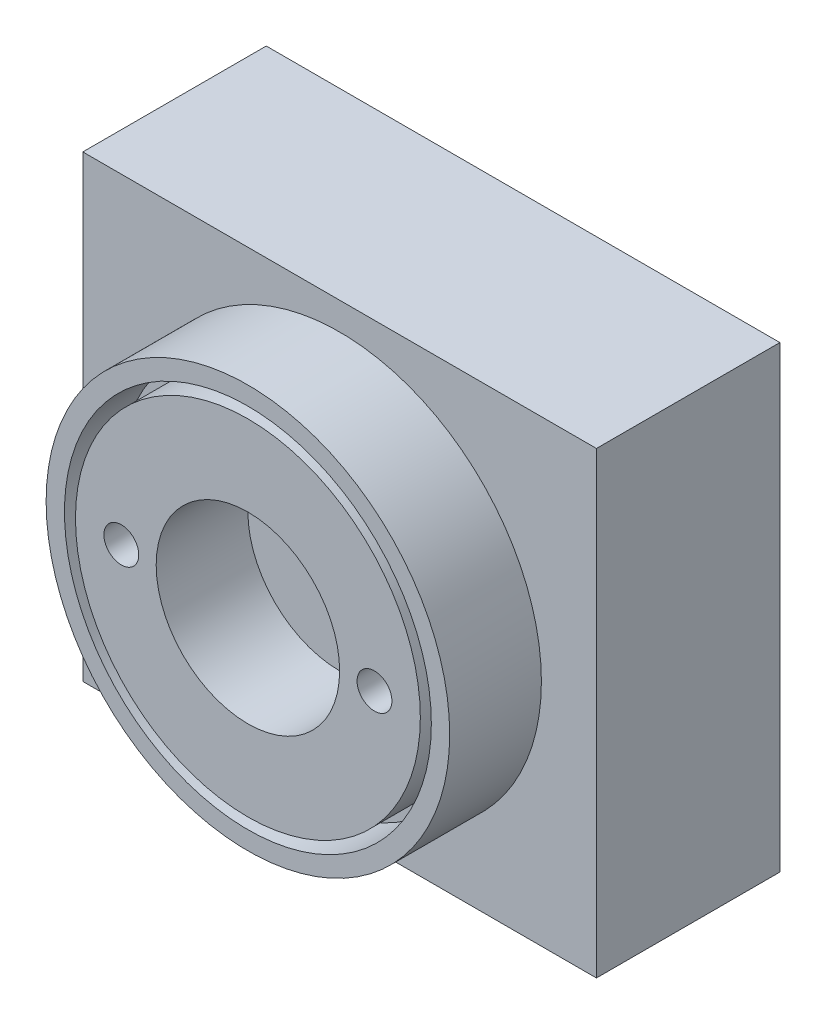
ISO-10303-21;
HEADER;
FILE_DESCRIPTION(('STEP AP214'),'2;1');
FILE_NAME('part.step','',(''),(''),'','','');
FILE_SCHEMA(('AUTOMOTIVE_DESIGN { 1 0 10303 214 1 1 1 1 }'));
ENDSEC;
DATA;
#1=APPLICATION_CONTEXT('core data for automotive mechanical design processes');
#2=APPLICATION_PROTOCOL_DEFINITION('international standard','automotive_design',2000,#1);
#3=PRODUCT_CONTEXT('',#1,'mechanical');
#4=PRODUCT('Part','Part','',(#3));
#5=PRODUCT_RELATED_PRODUCT_CATEGORY('part','',(#4));
#6=PRODUCT_DEFINITION_FORMATION('','',#4);
#7=PRODUCT_DEFINITION_CONTEXT('part definition',#1,'design');
#8=PRODUCT_DEFINITION('design','',#6,#7);
#9=PRODUCT_DEFINITION_SHAPE('','',#8);
#10=(LENGTH_UNIT() NAMED_UNIT(*) SI_UNIT(.MILLI.,.METRE.));
#11=(NAMED_UNIT(*) PLANE_ANGLE_UNIT() SI_UNIT($,.RADIAN.));
#12=(NAMED_UNIT(*) SI_UNIT($,.STERADIAN.) SOLID_ANGLE_UNIT());
#13=UNCERTAINTY_MEASURE_WITH_UNIT(LENGTH_MEASURE(1.E-05),#10,'distance_accuracy_value','');
#14=(GEOMETRIC_REPRESENTATION_CONTEXT(3) GLOBAL_UNCERTAINTY_ASSIGNED_CONTEXT((#13)) GLOBAL_UNIT_ASSIGNED_CONTEXT((#10,
#11,#12)) REPRESENTATION_CONTEXT('',''));
#15=CARTESIAN_POINT('',(0.,0.,0.));
#16=DIRECTION('',(0.,0.,1.));
#17=DIRECTION('',(1.,0.,0.));
#18=AXIS2_PLACEMENT_3D('',#15,#16,#17);
#19=CARTESIAN_POINT('',(0.,0.,10.));
#20=DIRECTION('',(0.,0.,1.));
#21=DIRECTION('',(1.,0.,0.));
#22=AXIS2_PLACEMENT_3D('',#19,#20,#21);
#23=PLANE('',#22);
#24=CARTESIAN_POINT('',(0.,0.,10.));
#25=DIRECTION('',(0.,0.,1.));
#26=DIRECTION('',(1.,0.,0.));
#27=AXIS2_PLACEMENT_3D('',#24,#25,#26);
#28=CIRCLE('',#27,47.);
#29=CARTESIAN_POINT('',(47.,0.,10.));
#30=VERTEX_POINT('',#29);
#31=EDGE_CURVE('E137',#30,#30,#28,.T.);
#32=ORIENTED_EDGE('',*,*,#31,.T.);
#33=EDGE_LOOP('',(#32));
#34=FACE_BOUND('',#33,.T.);
#35=CARTESIAN_POINT('',(34.5,0.,10.));
#36=DIRECTION('',(0.,0.,1.));
#37=DIRECTION('',(1.,0.,0.));
#38=AXIS2_PLACEMENT_3D('',#35,#36,#37);
#39=CIRCLE('',#38,4.75);
#40=CARTESIAN_POINT('',(39.25,0.,10.));
#41=VERTEX_POINT('',#40);
#42=EDGE_CURVE('E145',#41,#41,#39,.F.);
#43=ORIENTED_EDGE('',*,*,#42,.T.);
#44=EDGE_LOOP('',(#43));
#45=FACE_BOUND('',#44,.T.);
#46=CARTESIAN_POINT('',(0.,0.,10.));
#47=DIRECTION('',(0.,0.,1.));
#48=DIRECTION('',(1.,0.,0.));
#49=AXIS2_PLACEMENT_3D('',#46,#47,#48);
#50=CIRCLE('',#49,25.);
#51=CARTESIAN_POINT('',(25.,0.,10.));
#52=VERTEX_POINT('',#51);
#53=EDGE_CURVE('E151',#52,#52,#50,.T.);
#54=ORIENTED_EDGE('',*,*,#53,.F.);
#55=EDGE_LOOP('',(#54));
#56=FACE_BOUND('',#55,.T.);
#57=CARTESIAN_POINT('',(-34.5,0.,10.));
#58=DIRECTION('',(0.,0.,1.));
#59=DIRECTION('',(1.,0.,0.));
#60=AXIS2_PLACEMENT_3D('',#57,#58,#59);
#61=CIRCLE('',#60,4.75);
#62=CARTESIAN_POINT('',(-29.75,0.,10.));
#63=VERTEX_POINT('',#62);
#64=EDGE_CURVE('E136',#63,#63,#61,.T.);
#65=ORIENTED_EDGE('',*,*,#64,.F.);
#66=EDGE_LOOP('',(#65));
#67=FACE_BOUND('',#66,.T.);
#68=ADVANCED_FACE('F51',(#34,#45,#56,#67),#23,.T.);
#69=CARTESIAN_POINT('',(0.,0.,10.));
#70=DIRECTION('',(0.,0.,1.));
#71=DIRECTION('',(1.,0.,0.));
#72=AXIS2_PLACEMENT_3D('',#69,#70,#71);
#73=CIRCLE('',#72,55.);
#74=CARTESIAN_POINT('',(55.,0.,10.));
#75=VERTEX_POINT('',#74);
#76=EDGE_CURVE('E61',#75,#75,#73,.T.);
#77=ORIENTED_EDGE('',*,*,#76,.T.);
#78=EDGE_LOOP('',(#77));
#79=FACE_BOUND('',#78,.T.);
#80=CARTESIAN_POINT('',(0.,0.,10.));
#81=DIRECTION('',(0.,0.,1.));
#82=DIRECTION('',(1.,0.,0.));
#83=AXIS2_PLACEMENT_3D('',#80,#81,#82);
#84=CIRCLE('',#83,50.);
#85=CARTESIAN_POINT('',(50.,0.,10.));
#86=VERTEX_POINT('',#85);
#87=EDGE_CURVE('E133',#86,#86,#84,.T.);
#88=ORIENTED_EDGE('',*,*,#87,.F.);
#89=EDGE_LOOP('',(#88));
#90=FACE_BOUND('',#89,.T.);
#91=ADVANCED_FACE('F159',(#79,#90),#23,.T.);
#92=CARTESIAN_POINT('',(0.,0.,-15.));
#93=DIRECTION('',(0.,0.,1.));
#94=DIRECTION('',(1.,0.,0.));
#95=AXIS2_PLACEMENT_3D('',#92,#93,#94);
#96=CYLINDRICAL_SURFACE('',#95,55.);
#97=CARTESIAN_POINT('',(0.,0.,-15.));
#98=DIRECTION('',(0.,0.,1.));
#99=DIRECTION('',(1.,0.,0.));
#100=AXIS2_PLACEMENT_3D('',#97,#98,#99);
#101=CIRCLE('',#100,55.);
#102=CARTESIAN_POINT('',(55.,0.,-15.));
#103=VERTEX_POINT('',#102);
#104=EDGE_CURVE('E55',#103,#103,#101,.T.);
#105=ORIENTED_EDGE('',*,*,#104,.T.);
#106=EDGE_LOOP('',(#105));
#107=FACE_BOUND('',#106,.T.);
#108=ORIENTED_EDGE('',*,*,#76,.F.);
#109=EDGE_LOOP('',(#108));
#110=FACE_BOUND('',#109,.T.);
#111=ADVANCED_FACE('F53',(#107,#110),#96,.T.);
#112=CARTESIAN_POINT('',(0.,0.,-15.));
#113=DIRECTION('',(0.,0.,1.));
#114=DIRECTION('',(1.,0.,0.));
#115=AXIS2_PLACEMENT_3D('',#112,#113,#114);
#116=CYLINDRICAL_SURFACE('',#115,25.);
#117=CARTESIAN_POINT('',(0.,0.,-15.));
#118=DIRECTION('',(0.,0.,1.));
#119=DIRECTION('',(1.,0.,0.));
#120=AXIS2_PLACEMENT_3D('',#117,#118,#119);
#121=CIRCLE('',#120,25.);
#122=CARTESIAN_POINT('',(25.,0.,-15.));
#123=VERTEX_POINT('',#122);
#124=EDGE_CURVE('E12',#123,#123,#121,.T.);
#125=ORIENTED_EDGE('',*,*,#124,.F.);
#126=EDGE_LOOP('',(#125));
#127=FACE_BOUND('',#126,.T.);
#128=ORIENTED_EDGE('',*,*,#53,.T.);
#129=EDGE_LOOP('',(#128));
#130=FACE_BOUND('',#129,.T.);
#131=ADVANCED_FACE('F163',(#127,#130),#116,.F.);
#132=CARTESIAN_POINT('',(34.5,0.,-5.));
#133=DIRECTION('',(0.,0.,1.));
#134=DIRECTION('',(1.,0.,0.));
#135=AXIS2_PLACEMENT_3D('',#132,#133,#134);
#136=CYLINDRICAL_SURFACE('',#135,4.75);
#137=CARTESIAN_POINT('',(34.5,0.,-5.));
#138=DIRECTION('',(0.,0.,1.));
#139=DIRECTION('',(1.,0.,0.));
#140=AXIS2_PLACEMENT_3D('',#137,#138,#139);
#141=CIRCLE('',#140,4.75);
#142=CARTESIAN_POINT('',(39.25,0.,-5.));
#143=VERTEX_POINT('',#142);
#144=EDGE_CURVE('E148',#143,#143,#141,.F.);
#145=ORIENTED_EDGE('',*,*,#144,.T.);
#146=EDGE_LOOP('',(#145));
#147=FACE_BOUND('',#146,.T.);
#148=ORIENTED_EDGE('',*,*,#42,.F.);
#149=EDGE_LOOP('',(#148));
#150=FACE_BOUND('',#149,.T.);
#151=ADVANCED_FACE('F169',(#147,#150),#136,.F.);
#152=CARTESIAN_POINT('',(0.,0.,-5.));
#153=DIRECTION('',(0.,0.,1.));
#154=DIRECTION('',(1.,0.,0.));
#155=AXIS2_PLACEMENT_3D('',#152,#153,#154);
#156=PLANE('',#155);
#157=ORIENTED_EDGE('',*,*,#144,.F.);
#158=EDGE_LOOP('',(#157));
#159=FACE_BOUND('',#158,.T.);
#160=ADVANCED_FACE('F181',(#159),#156,.T.);
#161=CARTESIAN_POINT('',(0.,0.,-5.));
#162=DIRECTION('',(0.,0.,1.));
#163=DIRECTION('',(1.,0.,0.));
#164=AXIS2_PLACEMENT_3D('',#161,#162,#163);
#165=CYLINDRICAL_SURFACE('',#164,47.);
#166=CARTESIAN_POINT('',(0.,0.,-5.));
#167=DIRECTION('',(0.,0.,1.));
#168=DIRECTION('',(1.,0.,0.));
#169=AXIS2_PLACEMENT_3D('',#166,#167,#168);
#170=CIRCLE('',#169,47.);
#171=CARTESIAN_POINT('',(47.,0.,-5.));
#172=VERTEX_POINT('',#171);
#173=EDGE_CURVE('E129',#172,#172,#170,.T.);
#174=ORIENTED_EDGE('',*,*,#173,.T.);
#175=EDGE_LOOP('',(#174));
#176=FACE_BOUND('',#175,.T.);
#177=ORIENTED_EDGE('',*,*,#31,.F.);
#178=EDGE_LOOP('',(#177));
#179=FACE_BOUND('',#178,.T.);
#180=ADVANCED_FACE('F185',(#176,#179),#165,.T.);
#181=CARTESIAN_POINT('',(0.,0.,-5.));
#182=DIRECTION('',(0.,0.,1.));
#183=DIRECTION('',(1.,0.,0.));
#184=AXIS2_PLACEMENT_3D('',#181,#182,#183);
#185=CYLINDRICAL_SURFACE('',#184,50.);
#186=CARTESIAN_POINT('',(0.,0.,-5.));
#187=DIRECTION('',(0.,0.,1.));
#188=DIRECTION('',(1.,0.,0.));
#189=AXIS2_PLACEMENT_3D('',#186,#187,#188);
#190=CIRCLE('',#189,50.);
#191=CARTESIAN_POINT('',(50.,0.,-5.));
#192=VERTEX_POINT('',#191);
#193=EDGE_CURVE('E132',#192,#192,#190,.T.);
#194=ORIENTED_EDGE('',*,*,#193,.F.);
#195=EDGE_LOOP('',(#194));
#196=FACE_BOUND('',#195,.T.);
#197=ORIENTED_EDGE('',*,*,#87,.T.);
#198=EDGE_LOOP('',(#197));
#199=FACE_BOUND('',#198,.T.);
#200=ADVANCED_FACE('F199',(#196,#199),#185,.F.);
#201=CARTESIAN_POINT('',(0.,0.,-5.));
#202=DIRECTION('',(0.,0.,1.));
#203=DIRECTION('',(1.,0.,0.));
#204=AXIS2_PLACEMENT_3D('',#201,#202,#203);
#205=PLANE('',#204);
#206=ORIENTED_EDGE('',*,*,#173,.F.);
#207=EDGE_LOOP('',(#206));
#208=FACE_BOUND('',#207,.T.);
#209=ORIENTED_EDGE('',*,*,#193,.T.);
#210=EDGE_LOOP('',(#209));
#211=FACE_BOUND('',#210,.T.);
#212=ADVANCED_FACE('F191',(#208,#211),#205,.T.);
#213=CARTESIAN_POINT('',(-34.5,0.,-5.));
#214=DIRECTION('',(0.,0.,1.));
#215=DIRECTION('',(1.,0.,0.));
#216=AXIS2_PLACEMENT_3D('',#213,#214,#215);
#217=CYLINDRICAL_SURFACE('',#216,4.75);
#218=CARTESIAN_POINT('',(-34.5,0.,-5.));
#219=DIRECTION('',(0.,0.,1.));
#220=DIRECTION('',(1.,0.,0.));
#221=AXIS2_PLACEMENT_3D('',#218,#219,#220);
#222=CIRCLE('',#221,4.75);
#223=CARTESIAN_POINT('',(-29.75,0.,-5.));
#224=VERTEX_POINT('',#223);
#225=EDGE_CURVE('E142',#224,#224,#222,.T.);
#226=ORIENTED_EDGE('',*,*,#225,.F.);
#227=EDGE_LOOP('',(#226));
#228=FACE_BOUND('',#227,.T.);
#229=ORIENTED_EDGE('',*,*,#64,.T.);
#230=EDGE_LOOP('',(#229));
#231=FACE_BOUND('',#230,.T.);
#232=ADVANCED_FACE('F187',(#228,#231),#217,.F.);
#233=CARTESIAN_POINT('',(0.,0.,-5.));
#234=DIRECTION('',(0.,0.,1.));
#235=DIRECTION('',(1.,0.,0.));
#236=AXIS2_PLACEMENT_3D('',#233,#234,#235);
#237=PLANE('',#236);
#238=ORIENTED_EDGE('',*,*,#225,.T.);
#239=EDGE_LOOP('',(#238));
#240=FACE_BOUND('',#239,.T.);
#241=ADVANCED_FACE('F190',(#240),#237,.T.);
#242=CARTESIAN_POINT('',(0.,0.,-15.));
#243=DIRECTION('',(0.,0.,1.));
#244=DIRECTION('',(1.,0.,0.));
#245=AXIS2_PLACEMENT_3D('',#242,#243,#244);
#246=PLANE('',#245);
#247=ORIENTED_EDGE('',*,*,#104,.F.);
#248=EDGE_LOOP('',(#247));
#249=FACE_BOUND('',#248,.T.);
#250=DIRECTION('',(0.,1.,0.));
#251=VECTOR('',#250,1.);
#252=CARTESIAN_POINT('',(-70.,-62.5,-15.));
#253=LINE('',#252,#251);
#254=CARTESIAN_POINT('',(-70.,-62.5,-15.));
#255=VERTEX_POINT('',#254);
#256=CARTESIAN_POINT('',(-70.,62.5,-15.));
#257=VERTEX_POINT('',#256);
#258=EDGE_CURVE('E120',#255,#257,#253,.T.);
#259=ORIENTED_EDGE('',*,*,#258,.F.);
#260=DIRECTION('',(-1.,0.,0.));
#261=VECTOR('',#260,1.);
#262=CARTESIAN_POINT('',(70.,-62.5,-15.));
#263=LINE('',#262,#261);
#264=CARTESIAN_POINT('',(70.,-62.5,-15.));
#265=VERTEX_POINT('',#264);
#266=EDGE_CURVE('E92',#265,#255,#263,.T.);
#267=ORIENTED_EDGE('',*,*,#266,.F.);
#268=DIRECTION('',(0.,-1.,0.));
#269=VECTOR('',#268,1.);
#270=CARTESIAN_POINT('',(70.,-62.5,-15.));
#271=LINE('',#270,#269);
#272=CARTESIAN_POINT('',(70.,62.5,-15.));
#273=VERTEX_POINT('',#272);
#274=EDGE_CURVE('E86',#273,#265,#271,.T.);
#275=ORIENTED_EDGE('',*,*,#274,.F.);
#276=DIRECTION('',(1.,0.,0.));
#277=VECTOR('',#276,1.);
#278=CARTESIAN_POINT('',(70.,62.5,-15.));
#279=LINE('',#278,#277);
#280=EDGE_CURVE('E110',#257,#273,#279,.T.);
#281=ORIENTED_EDGE('',*,*,#280,.F.);
#282=EDGE_LOOP('',(#259,#267,#275,#281));
#283=FACE_BOUND('',#282,.T.);
#284=ADVANCED_FACE('F195',(#249,#283),#246,.T.);
#285=CARTESIAN_POINT('',(0.,0.,-65.));
#286=DIRECTION('',(0.,0.,1.));
#287=DIRECTION('',(1.,0.,0.));
#288=AXIS2_PLACEMENT_3D('',#285,#286,#287);
#289=PLANE('',#288);
#290=DIRECTION('',(0.,1.,0.));
#291=VECTOR('',#290,1.);
#292=CARTESIAN_POINT('',(-70.,-62.5,-65.));
#293=LINE('',#292,#291);
#294=CARTESIAN_POINT('',(-70.,-62.5,-65.));
#295=VERTEX_POINT('',#294);
#296=CARTESIAN_POINT('',(-70.,62.5,-65.));
#297=VERTEX_POINT('',#296);
#298=EDGE_CURVE('E105',#295,#297,#293,.T.);
#299=ORIENTED_EDGE('',*,*,#298,.T.);
#300=DIRECTION('',(1.,0.,0.));
#301=VECTOR('',#300,1.);
#302=CARTESIAN_POINT('',(70.,62.5,-65.));
#303=LINE('',#302,#301);
#304=CARTESIAN_POINT('',(70.,62.5,-65.));
#305=VERTEX_POINT('',#304);
#306=EDGE_CURVE('E100',#297,#305,#303,.T.);
#307=ORIENTED_EDGE('',*,*,#306,.T.);
#308=DIRECTION('',(0.,-1.,0.));
#309=VECTOR('',#308,1.);
#310=CARTESIAN_POINT('',(70.,-62.5,-65.));
#311=LINE('',#310,#309);
#312=CARTESIAN_POINT('',(70.,-62.5,-65.));
#313=VERTEX_POINT('',#312);
#314=EDGE_CURVE('E103',#305,#313,#311,.T.);
#315=ORIENTED_EDGE('',*,*,#314,.T.);
#316=DIRECTION('',(-1.,0.,0.));
#317=VECTOR('',#316,1.);
#318=CARTESIAN_POINT('',(70.,-62.5,-65.));
#319=LINE('',#318,#317);
#320=EDGE_CURVE('E69',#313,#295,#319,.T.);
#321=ORIENTED_EDGE('',*,*,#320,.T.);
#322=EDGE_LOOP('',(#299,#307,#315,#321));
#323=FACE_BOUND('',#322,.T.);
#324=ADVANCED_FACE('F101',(#323),#289,.F.);
#325=CARTESIAN_POINT('',(70.,-62.5,-65.));
#326=DIRECTION('',(0.,1.,0.));
#327=DIRECTION('',(0.,0.,1.));
#328=AXIS2_PLACEMENT_3D('',#325,#326,#327);
#329=PLANE('',#328);
#330=ORIENTED_EDGE('',*,*,#266,.T.);
#331=DIRECTION('',(0.,0.,1.));
#332=VECTOR('',#331,1.);
#333=CARTESIAN_POINT('',(-70.,-62.5,-65.));
#334=LINE('',#333,#332);
#335=EDGE_CURVE('E116',#295,#255,#334,.T.);
#336=ORIENTED_EDGE('',*,*,#335,.F.);
#337=ORIENTED_EDGE('',*,*,#320,.F.);
#338=DIRECTION('',(0.,0.,1.));
#339=VECTOR('',#338,1.);
#340=CARTESIAN_POINT('',(70.,-62.5,-65.));
#341=LINE('',#340,#339);
#342=EDGE_CURVE('E112',#313,#265,#341,.T.);
#343=ORIENTED_EDGE('',*,*,#342,.T.);
#344=EDGE_LOOP('',(#330,#336,#337,#343));
#345=FACE_BOUND('',#344,.T.);
#346=ADVANCED_FACE('F216',(#345),#329,.F.);
#347=CARTESIAN_POINT('',(70.,-62.5,-65.));
#348=DIRECTION('',(-1.,0.,0.));
#349=DIRECTION('',(0.,0.,1.));
#350=AXIS2_PLACEMENT_3D('',#347,#348,#349);
#351=PLANE('',#350);
#352=ORIENTED_EDGE('',*,*,#274,.T.);
#353=ORIENTED_EDGE('',*,*,#342,.F.);
#354=ORIENTED_EDGE('',*,*,#314,.F.);
#355=DIRECTION('',(0.,0.,1.));
#356=VECTOR('',#355,1.);
#357=CARTESIAN_POINT('',(70.,62.5,-65.));
#358=LINE('',#357,#356);
#359=EDGE_CURVE('E108',#305,#273,#358,.T.);
#360=ORIENTED_EDGE('',*,*,#359,.T.);
#361=EDGE_LOOP('',(#352,#353,#354,#360));
#362=FACE_BOUND('',#361,.T.);
#363=ADVANCED_FACE('F114',(#362),#351,.F.);
#364=CARTESIAN_POINT('',(70.,62.5,-65.));
#365=DIRECTION('',(0.,-1.,0.));
#366=DIRECTION('',(0.,0.,-1.));
#367=AXIS2_PLACEMENT_3D('',#364,#365,#366);
#368=PLANE('',#367);
#369=ORIENTED_EDGE('',*,*,#280,.T.);
#370=ORIENTED_EDGE('',*,*,#359,.F.);
#371=ORIENTED_EDGE('',*,*,#306,.F.);
#372=DIRECTION('',(0.,0.,1.));
#373=VECTOR('',#372,1.);
#374=CARTESIAN_POINT('',(-70.,62.5,-65.));
#375=LINE('',#374,#373);
#376=EDGE_CURVE('E111',#297,#257,#375,.T.);
#377=ORIENTED_EDGE('',*,*,#376,.T.);
#378=EDGE_LOOP('',(#369,#370,#371,#377));
#379=FACE_BOUND('',#378,.T.);
#380=ADVANCED_FACE('F109',(#379),#368,.F.);
#381=CARTESIAN_POINT('',(-70.,-62.5,-65.));
#382=DIRECTION('',(1.,0.,0.));
#383=DIRECTION('',(0.,0.,-1.));
#384=AXIS2_PLACEMENT_3D('',#381,#382,#383);
#385=PLANE('',#384);
#386=ORIENTED_EDGE('',*,*,#258,.T.);
#387=ORIENTED_EDGE('',*,*,#376,.F.);
#388=ORIENTED_EDGE('',*,*,#298,.F.);
#389=ORIENTED_EDGE('',*,*,#335,.T.);
#390=EDGE_LOOP('',(#386,#387,#388,#389));
#391=FACE_BOUND('',#390,.T.);
#392=ADVANCED_FACE('F207',(#391),#385,.F.);
#393=ORIENTED_EDGE('',*,*,#124,.T.);
#394=EDGE_LOOP('',(#393));
#395=FACE_BOUND('',#394,.T.);
#396=ADVANCED_FACE('F210',(#395),#246,.T.);
#397=CLOSED_SHELL('',(#68,#91,#111,#131,#151,#160,#180,#200,#212,#232,#241,#284,#324,#346,#363,
#380,#392,#396));
#398=MANIFOLD_SOLID_BREP('B2',#397);
#399=ADVANCED_BREP_SHAPE_REPRESENTATION('',(#18,#398),#14);
#400=SHAPE_DEFINITION_REPRESENTATION(#9,#399);
ENDSEC;
END-ISO-10303-21;
